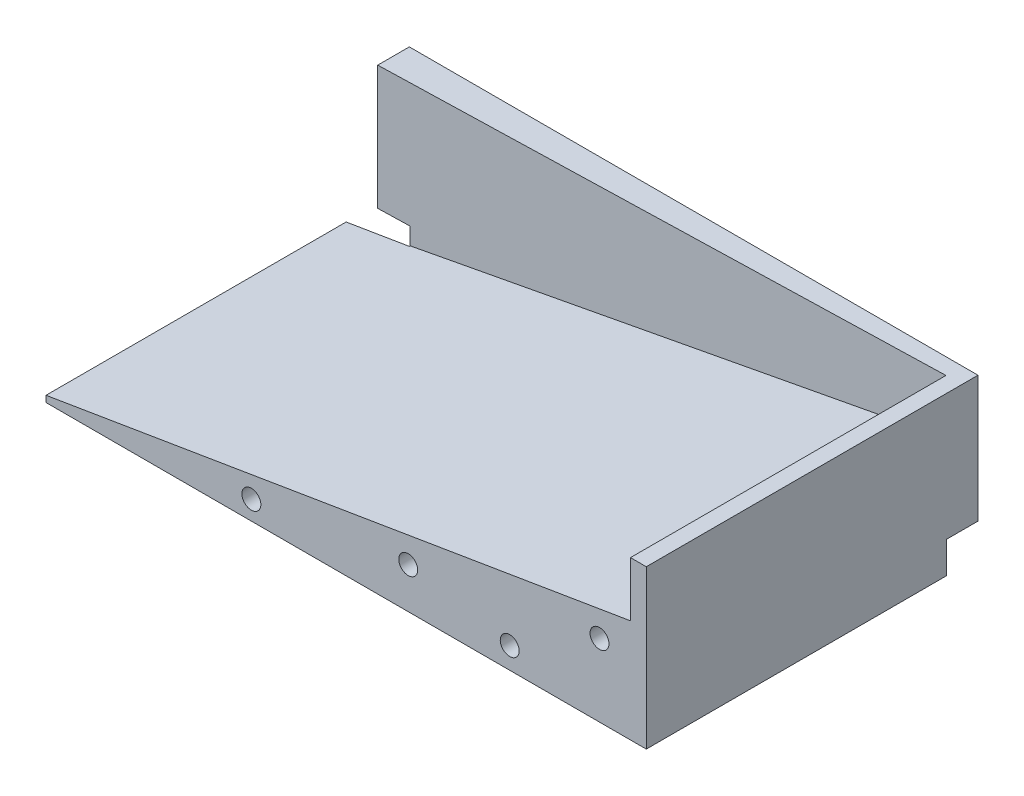
ISO-10303-21;
HEADER;
FILE_DESCRIPTION(('STEP AP214'),'2;1');
FILE_NAME('part.step','',(''),(''),'','','');
FILE_SCHEMA(('AUTOMOTIVE_DESIGN { 1 0 10303 214 1 1 1 1 }'));
ENDSEC;
DATA;
#1=APPLICATION_CONTEXT('core data for automotive mechanical design processes');
#2=APPLICATION_PROTOCOL_DEFINITION('international standard','automotive_design',2000,#1);
#3=PRODUCT_CONTEXT('',#1,'mechanical');
#4=PRODUCT('Part','Part','',(#3));
#5=PRODUCT_RELATED_PRODUCT_CATEGORY('part','',(#4));
#6=PRODUCT_DEFINITION_FORMATION('','',#4);
#7=PRODUCT_DEFINITION_CONTEXT('part definition',#1,'design');
#8=PRODUCT_DEFINITION('design','',#6,#7);
#9=PRODUCT_DEFINITION_SHAPE('','',#8);
#10=(LENGTH_UNIT() NAMED_UNIT(*) SI_UNIT(.MILLI.,.METRE.));
#11=(NAMED_UNIT(*) PLANE_ANGLE_UNIT() SI_UNIT($,.RADIAN.));
#12=(NAMED_UNIT(*) SI_UNIT($,.STERADIAN.) SOLID_ANGLE_UNIT());
#13=UNCERTAINTY_MEASURE_WITH_UNIT(LENGTH_MEASURE(1.E-05),#10,'distance_accuracy_value','');
#14=(GEOMETRIC_REPRESENTATION_CONTEXT(3) GLOBAL_UNCERTAINTY_ASSIGNED_CONTEXT((#13)) GLOBAL_UNIT_ASSIGNED_CONTEXT((#10,
#11,#12)) REPRESENTATION_CONTEXT('',''));
#15=CARTESIAN_POINT('',(0.,0.,0.));
#16=DIRECTION('',(0.,0.,1.));
#17=DIRECTION('',(1.,0.,0.));
#18=AXIS2_PLACEMENT_3D('',#15,#16,#17);
#19=CARTESIAN_POINT('',(-40.7960134047091,6.,200.));
#20=DIRECTION('',(0.,0.,-1.));
#21=DIRECTION('',(-1.,0.,0.));
#22=AXIS2_PLACEMENT_3D('',#19,#20,#21);
#23=CYLINDRICAL_SURFACE('',#22,3.);
#24=CARTESIAN_POINT('',(-40.7960134047091,6.,10.));
#25=DIRECTION('',(0.,0.,-1.));
#26=DIRECTION('',(-1.,0.,0.));
#27=AXIS2_PLACEMENT_3D('',#24,#25,#26);
#28=CIRCLE('',#27,3.);
#29=CARTESIAN_POINT('',(-43.7960134047091,6.,10.));
#30=VERTEX_POINT('',#29);
#31=EDGE_CURVE('E168',#30,#30,#28,.T.);
#32=ORIENTED_EDGE('',*,*,#31,.T.);
#33=EDGE_LOOP('',(#32));
#34=FACE_BOUND('',#33,.T.);
#35=CARTESIAN_POINT('',(-40.7960134047091,6.,100.));
#36=DIRECTION('',(0.,0.,1.));
#37=DIRECTION('',(1.,0.,0.));
#38=AXIS2_PLACEMENT_3D('',#35,#36,#37);
#39=CIRCLE('',#38,3.);
#40=CARTESIAN_POINT('',(-37.7960134047091,6.,100.));
#41=VERTEX_POINT('',#40);
#42=EDGE_CURVE('E157',#41,#41,#39,.T.);
#43=ORIENTED_EDGE('',*,*,#42,.T.);
#44=EDGE_LOOP('',(#43));
#45=FACE_BOUND('',#44,.T.);
#46=ADVANCED_FACE('F37',(#34,#45),#23,.F.);
#47=CARTESIAN_POINT('',(8.86154286614935,12.9010851063287,200.));
#48=DIRECTION('',(0.,0.,-1.));
#49=DIRECTION('',(-1.,0.,0.));
#50=AXIS2_PLACEMENT_3D('',#47,#48,#49);
#51=CYLINDRICAL_SURFACE('',#50,3.);
#52=CARTESIAN_POINT('',(8.86154286614935,12.9010851063287,10.));
#53=DIRECTION('',(0.,0.,-1.));
#54=DIRECTION('',(-1.,0.,0.));
#55=AXIS2_PLACEMENT_3D('',#52,#53,#54);
#56=CIRCLE('',#55,3.);
#57=CARTESIAN_POINT('',(5.86154286614935,12.9010851063287,10.));
#58=VERTEX_POINT('',#57);
#59=EDGE_CURVE('E174',#58,#58,#56,.T.);
#60=ORIENTED_EDGE('',*,*,#59,.T.);
#61=EDGE_LOOP('',(#60));
#62=FACE_BOUND('',#61,.T.);
#63=CARTESIAN_POINT('',(8.86154286614935,12.9010851063287,100.));
#64=DIRECTION('',(0.,0.,1.));
#65=DIRECTION('',(1.,0.,0.));
#66=AXIS2_PLACEMENT_3D('',#63,#64,#65);
#67=CIRCLE('',#66,3.);
#68=CARTESIAN_POINT('',(11.8615428661494,12.9010851063287,100.));
#69=VERTEX_POINT('',#68);
#70=EDGE_CURVE('E162',#69,#69,#67,.T.);
#71=ORIENTED_EDGE('',*,*,#70,.T.);
#72=EDGE_LOOP('',(#71));
#73=FACE_BOUND('',#72,.T.);
#74=ADVANCED_FACE('F270',(#62,#73),#51,.F.);
#75=CARTESIAN_POINT('',(40.9814690667464,6.77616521020496,200.));
#76=DIRECTION('',(0.,0.,-1.));
#77=DIRECTION('',(-1.,0.,0.));
#78=AXIS2_PLACEMENT_3D('',#75,#76,#77);
#79=CYLINDRICAL_SURFACE('',#78,3.00000000000001);
#80=CARTESIAN_POINT('',(40.9814690667464,6.77616521020496,10.));
#81=DIRECTION('',(0.,0.,-1.));
#82=DIRECTION('',(-1.,0.,0.));
#83=AXIS2_PLACEMENT_3D('',#80,#81,#82);
#84=CIRCLE('',#83,3.00000000000001);
#85=CARTESIAN_POINT('',(37.9814690667464,6.77616521020496,10.));
#86=VERTEX_POINT('',#85);
#87=EDGE_CURVE('E181',#86,#86,#84,.T.);
#88=ORIENTED_EDGE('',*,*,#87,.T.);
#89=EDGE_LOOP('',(#88));
#90=FACE_BOUND('',#89,.T.);
#91=CARTESIAN_POINT('',(40.9814690667464,6.77616521020496,100.));
#92=DIRECTION('',(0.,0.,1.));
#93=DIRECTION('',(1.,0.,0.));
#94=AXIS2_PLACEMENT_3D('',#91,#92,#93);
#95=CIRCLE('',#94,3.00000000000001);
#96=CARTESIAN_POINT('',(43.9814690667464,6.77616521020496,100.));
#97=VERTEX_POINT('',#96);
#98=EDGE_CURVE('E533',#97,#97,#95,.T.);
#99=ORIENTED_EDGE('',*,*,#98,.T.);
#100=EDGE_LOOP('',(#99));
#101=FACE_BOUND('',#100,.T.);
#102=ADVANCED_FACE('F321',(#90,#101),#79,.F.);
#103=CARTESIAN_POINT('',(69.4060048708337,22.9393971638675,200.));
#104=DIRECTION('',(0.,0.,-1.));
#105=DIRECTION('',(-1.,0.,0.));
#106=AXIS2_PLACEMENT_3D('',#103,#104,#105);
#107=CYLINDRICAL_SURFACE('',#106,3.00000000000001);
#108=CARTESIAN_POINT('',(69.4060048708337,22.9393971638675,10.));
#109=DIRECTION('',(0.,0.,-1.));
#110=DIRECTION('',(-1.,0.,0.));
#111=AXIS2_PLACEMENT_3D('',#108,#109,#110);
#112=CIRCLE('',#111,3.00000000000001);
#113=CARTESIAN_POINT('',(66.4060048708336,22.9393971638675,10.));
#114=VERTEX_POINT('',#113);
#115=EDGE_CURVE('E188',#114,#114,#112,.T.);
#116=ORIENTED_EDGE('',*,*,#115,.T.);
#117=EDGE_LOOP('',(#116));
#118=FACE_BOUND('',#117,.T.);
#119=CARTESIAN_POINT('',(69.4060048708337,22.9393971638675,100.));
#120=DIRECTION('',(0.,0.,1.));
#121=DIRECTION('',(1.,0.,0.));
#122=AXIS2_PLACEMENT_3D('',#119,#120,#121);
#123=CIRCLE('',#122,3.00000000000001);
#124=CARTESIAN_POINT('',(72.4060048708337,22.9393971638675,100.));
#125=VERTEX_POINT('',#124);
#126=EDGE_CURVE('E150',#125,#125,#123,.T.);
#127=ORIENTED_EDGE('',*,*,#126,.T.);
#128=EDGE_LOOP('',(#127));
#129=FACE_BOUND('',#128,.T.);
#130=ADVANCED_FACE('F329',(#118,#129),#107,.F.);
#131=CARTESIAN_POINT('',(-105.796013404709,2.,200.));
#132=DIRECTION('',(0.163567680624933,-0.986532114963816,0.));
#133=DIRECTION('',(0.986532114963816,0.163567680624933,0.));
#134=AXIS2_PLACEMENT_3D('',#131,#132,#133);
#135=PLANE('',#134);
#136=DIRECTION('',(-0.986532114963816,-0.163567680624933,0.));
#137=VECTOR('',#136,1.);
#138=CARTESIAN_POINT('',(-105.796013404709,2.,100.));
#139=LINE('',#138,#137);
#140=CARTESIAN_POINT('',(79.2039865952909,32.6731230100121,100.));
#141=VERTEX_POINT('',#140);
#142=CARTESIAN_POINT('',(-105.796013404709,2.,100.));
#143=VERTEX_POINT('',#142);
#144=EDGE_CURVE('E138',#141,#143,#139,.T.);
#145=ORIENTED_EDGE('',*,*,#144,.F.);
#146=DIRECTION('',(0.,0.,-1.));
#147=VECTOR('',#146,1.);
#148=CARTESIAN_POINT('',(79.2039865952909,32.6731230100121,217.967909160371));
#149=LINE('',#148,#147);
#150=CARTESIAN_POINT('',(79.2039865952909,32.6731230100121,0.138888888888883));
#151=VERTEX_POINT('',#150);
#152=EDGE_CURVE('E146',#141,#151,#149,.T.);
#153=ORIENTED_EDGE('',*,*,#152,.T.);
#154=DIRECTION('',(-0.986161899831777,-0.163506298709877,0.0273933861064383));
#155=VECTOR('',#154,1.);
#156=CARTESIAN_POINT('',(-111.056300597368,1.12784088579239,5.42389686646275));
#157=LINE('',#156,#155);
#158=CARTESIAN_POINT('',(-85.7960134047091,5.31601329837969,4.72222222222223));
#159=VERTEX_POINT('',#158);
#160=EDGE_CURVE('E243',#151,#159,#157,.T.);
#161=ORIENTED_EDGE('',*,*,#160,.T.);
#162=DIRECTION('',(0.,0.,1.));
#163=VECTOR('',#162,1.);
#164=CARTESIAN_POINT('',(-85.7960134047091,5.31601329837969,200.));
#165=LINE('',#164,#163);
#166=CARTESIAN_POINT('',(-85.7960134047091,5.31601329837969,5.));
#167=VERTEX_POINT('',#166);
#168=EDGE_CURVE('E235',#159,#167,#165,.T.);
#169=ORIENTED_EDGE('',*,*,#168,.T.);
#170=DIRECTION('',(0.986532114963816,0.163567680624933,0.));
#171=VECTOR('',#170,1.);
#172=CARTESIAN_POINT('',(-105.796013404709,2.,5.));
#173=LINE('',#172,#171);
#174=CARTESIAN_POINT('',(-105.796013404709,2.,5.));
#175=VERTEX_POINT('',#174);
#176=EDGE_CURVE('E230',#175,#167,#173,.T.);
#177=ORIENTED_EDGE('',*,*,#176,.F.);
#178=DIRECTION('',(0.,0.,-1.));
#179=VECTOR('',#178,1.);
#180=CARTESIAN_POINT('',(-105.796013404709,2.,200.));
#181=LINE('',#180,#179);
#182=EDGE_CURVE('E149',#143,#175,#181,.T.);
#183=ORIENTED_EDGE('',*,*,#182,.F.);
#184=EDGE_LOOP('',(#145,#153,#161,#169,#177,#183));
#185=FACE_BOUND('',#184,.T.);
#186=ADVANCED_FACE('F145',(#185),#135,.F.);
#187=CARTESIAN_POINT('',(-105.796013404709,0.,200.));
#188=DIRECTION('',(1.,0.,0.));
#189=DIRECTION('',(0.,0.,-1.));
#190=AXIS2_PLACEMENT_3D('',#187,#188,#189);
#191=PLANE('',#190);
#192=DIRECTION('',(0.,-1.,0.));
#193=VECTOR('',#192,1.);
#194=CARTESIAN_POINT('',(-105.796013404709,0.,100.));
#195=LINE('',#194,#193);
#196=CARTESIAN_POINT('',(-105.796013404709,0.,100.));
#197=VERTEX_POINT('',#196);
#198=EDGE_CURVE('E151',#143,#197,#195,.T.);
#199=ORIENTED_EDGE('',*,*,#198,.F.);
#200=ORIENTED_EDGE('',*,*,#182,.T.);
#201=DIRECTION('',(0.,1.,0.));
#202=VECTOR('',#201,1.);
#203=CARTESIAN_POINT('',(-105.796013404709,0.,5.));
#204=LINE('',#203,#202);
#205=CARTESIAN_POINT('',(-105.796013404709,0.,5.));
#206=VERTEX_POINT('',#205);
#207=EDGE_CURVE('E214',#206,#175,#204,.T.);
#208=ORIENTED_EDGE('',*,*,#207,.F.);
#209=DIRECTION('',(0.,0.,-1.));
#210=VECTOR('',#209,1.);
#211=CARTESIAN_POINT('',(-105.796013404709,0.,200.));
#212=LINE('',#211,#210);
#213=EDGE_CURVE('E260',#197,#206,#212,.T.);
#214=ORIENTED_EDGE('',*,*,#213,.F.);
#215=EDGE_LOOP('',(#199,#200,#208,#214));
#216=FACE_BOUND('',#215,.T.);
#217=ADVANCED_FACE('F39',(#216),#191,.F.);
#218=CARTESIAN_POINT('',(-105.796013404709,0.,200.));
#219=DIRECTION('',(0.,1.,0.));
#220=DIRECTION('',(0.,0.,1.));
#221=AXIS2_PLACEMENT_3D('',#218,#219,#220);
#222=PLANE('',#221);
#223=DIRECTION('',(1.,0.,0.));
#224=VECTOR('',#223,1.);
#225=CARTESIAN_POINT('',(-105.796013404709,0.,100.));
#226=LINE('',#225,#224);
#227=CARTESIAN_POINT('',(84.2039865952909,0.,100.));
#228=VERTEX_POINT('',#227);
#229=EDGE_CURVE('E349',#197,#228,#226,.T.);
#230=ORIENTED_EDGE('',*,*,#229,.F.);
#231=ORIENTED_EDGE('',*,*,#213,.T.);
#232=DIRECTION('',(-1.,0.,0.));
#233=VECTOR('',#232,1.);
#234=CARTESIAN_POINT('',(-105.796013404709,0.,5.));
#235=LINE('',#234,#233);
#236=CARTESIAN_POINT('',(-85.7960134047091,0.,5.));
#237=VERTEX_POINT('',#236);
#238=EDGE_CURVE('E220',#237,#206,#235,.T.);
#239=ORIENTED_EDGE('',*,*,#238,.F.);
#240=DIRECTION('',(0.,0.,-1.));
#241=VECTOR('',#240,1.);
#242=CARTESIAN_POINT('',(-85.7960134047091,0.,5.));
#243=LINE('',#242,#241);
#244=CARTESIAN_POINT('',(-85.7960134047091,0.,-5.));
#245=VERTEX_POINT('',#244);
#246=EDGE_CURVE('E227',#237,#245,#243,.T.);
#247=ORIENTED_EDGE('',*,*,#246,.T.);
#248=DIRECTION('',(1.,0.,0.));
#249=VECTOR('',#248,1.);
#250=CARTESIAN_POINT('',(-95.7960134047091,0.,-5.));
#251=LINE('',#250,#249);
#252=CARTESIAN_POINT('',(74.2039865952908,0.,-5.));
#253=VERTEX_POINT('',#252);
#254=EDGE_CURVE('E364',#245,#253,#251,.T.);
#255=ORIENTED_EDGE('',*,*,#254,.T.);
#256=DIRECTION('',(0.,0.,-1.));
#257=VECTOR('',#256,1.);
#258=CARTESIAN_POINT('',(74.2039865952909,0.,-5.));
#259=LINE('',#258,#257);
#260=CARTESIAN_POINT('',(74.2039865952909,0.,5.));
#261=VERTEX_POINT('',#260);
#262=EDGE_CURVE('E59',#261,#253,#259,.T.);
#263=ORIENTED_EDGE('',*,*,#262,.F.);
#264=DIRECTION('',(1.,0.,0.));
#265=VECTOR('',#264,1.);
#266=CARTESIAN_POINT('',(74.2039865952909,0.,5.));
#267=LINE('',#266,#265);
#268=CARTESIAN_POINT('',(84.2039865952909,0.,5.));
#269=VERTEX_POINT('',#268);
#270=EDGE_CURVE('E207',#261,#269,#267,.T.);
#271=ORIENTED_EDGE('',*,*,#270,.T.);
#272=DIRECTION('',(0.,0.,-1.));
#273=VECTOR('',#272,1.);
#274=CARTESIAN_POINT('',(84.2039865952909,0.,200.));
#275=LINE('',#274,#273);
#276=EDGE_CURVE('E352',#228,#269,#275,.T.);
#277=ORIENTED_EDGE('',*,*,#276,.F.);
#278=EDGE_LOOP('',(#230,#231,#239,#247,#255,#263,#271,#277));
#279=FACE_BOUND('',#278,.T.);
#280=ADVANCED_FACE('F339',(#279),#222,.F.);
#281=CARTESIAN_POINT('',(84.2039865952909,0.,200.));
#282=DIRECTION('',(-1.,0.,0.));
#283=DIRECTION('',(0.,0.,1.));
#284=AXIS2_PLACEMENT_3D('',#281,#282,#283);
#285=PLANE('',#284);
#286=DIRECTION('',(0.,1.,0.));
#287=VECTOR('',#286,1.);
#288=CARTESIAN_POINT('',(84.2039865952909,0.,100.));
#289=LINE('',#288,#287);
#290=CARTESIAN_POINT('',(84.2039865952909,50.,100.));
#291=VERTEX_POINT('',#290);
#292=EDGE_CURVE('E354',#228,#291,#289,.T.);
#293=ORIENTED_EDGE('',*,*,#292,.F.);
#294=ORIENTED_EDGE('',*,*,#276,.T.);
#295=DIRECTION('',(0.,-1.,0.));
#296=VECTOR('',#295,1.);
#297=CARTESIAN_POINT('',(84.2039865952909,0.,5.));
#298=LINE('',#297,#296);
#299=CARTESIAN_POINT('',(84.2039865952909,10.,5.));
#300=VERTEX_POINT('',#299);
#301=EDGE_CURVE('E195',#300,#269,#298,.T.);
#302=ORIENTED_EDGE('',*,*,#301,.F.);
#303=DIRECTION('',(0.,0.,1.));
#304=VECTOR('',#303,1.);
#305=CARTESIAN_POINT('',(84.2039865952909,10.,-5.));
#306=LINE('',#305,#304);
#307=CARTESIAN_POINT('',(84.2039865952909,10.,-5.));
#308=VERTEX_POINT('',#307);
#309=EDGE_CURVE('E202',#308,#300,#306,.T.);
#310=ORIENTED_EDGE('',*,*,#309,.F.);
#311=DIRECTION('',(0.,1.,0.));
#312=VECTOR('',#311,1.);
#313=CARTESIAN_POINT('',(84.2039865952909,0.,-5.));
#314=LINE('',#313,#312);
#315=CARTESIAN_POINT('',(84.2039865952909,50.,-5.));
#316=VERTEX_POINT('',#315);
#317=EDGE_CURVE('E250',#308,#316,#314,.T.);
#318=ORIENTED_EDGE('',*,*,#317,.T.);
#319=DIRECTION('',(0.,0.,1.));
#320=VECTOR('',#319,1.);
#321=CARTESIAN_POINT('',(84.2039865952909,50.,200.));
#322=LINE('',#321,#320);
#323=EDGE_CURVE('E360',#316,#291,#322,.T.);
#324=ORIENTED_EDGE('',*,*,#323,.T.);
#325=EDGE_LOOP('',(#293,#294,#302,#310,#318,#324));
#326=FACE_BOUND('',#325,.T.);
#327=ADVANCED_FACE('F336',(#326),#285,.F.);
#328=CARTESIAN_POINT('',(-95.7960134047091,50.,200.));
#329=DIRECTION('',(0.,1.,0.));
#330=DIRECTION('',(0.,0.,1.));
#331=AXIS2_PLACEMENT_3D('',#328,#329,#330);
#332=PLANE('',#331);
#333=DIRECTION('',(0.,0.,-1.));
#334=VECTOR('',#333,1.);
#335=CARTESIAN_POINT('',(79.2039865952909,50.,217.967909160371));
#336=LINE('',#335,#334);
#337=CARTESIAN_POINT('',(79.2039865952909,50.,100.));
#338=VERTEX_POINT('',#337);
#339=CARTESIAN_POINT('',(79.2039865952909,50.,0.138888888888885));
#340=VERTEX_POINT('',#339);
#341=EDGE_CURVE('E156',#338,#340,#336,.T.);
#342=ORIENTED_EDGE('',*,*,#341,.F.);
#343=DIRECTION('',(1.,0.,0.));
#344=VECTOR('',#343,1.);
#345=CARTESIAN_POINT('',(-95.7960134047091,50.,100.));
#346=LINE('',#345,#344);
#347=EDGE_CURVE('E52',#338,#291,#346,.T.);
#348=ORIENTED_EDGE('',*,*,#347,.T.);
#349=ORIENTED_EDGE('',*,*,#323,.F.);
#350=DIRECTION('',(1.,0.,0.));
#351=VECTOR('',#350,1.);
#352=CARTESIAN_POINT('',(-95.7960134047091,50.,-5.));
#353=LINE('',#352,#351);
#354=CARTESIAN_POINT('',(-95.7960134047091,50.,-5.));
#355=VERTEX_POINT('',#354);
#356=EDGE_CURVE('E363',#355,#316,#353,.T.);
#357=ORIENTED_EDGE('',*,*,#356,.F.);
#358=DIRECTION('',(0.,0.,1.));
#359=VECTOR('',#358,1.);
#360=CARTESIAN_POINT('',(-95.7960134047091,50.,0.));
#361=LINE('',#360,#359);
#362=CARTESIAN_POINT('',(-95.7960134047091,50.,5.));
#363=VERTEX_POINT('',#362);
#364=EDGE_CURVE('E367',#355,#363,#361,.T.);
#365=ORIENTED_EDGE('',*,*,#364,.T.);
#366=DIRECTION('',(0.999614420652718,0.,-0.0277670672403533));
#367=VECTOR('',#366,1.);
#368=CARTESIAN_POINT('',(-95.7960134047091,50.,5.));
#369=LINE('',#368,#367);
#370=EDGE_CURVE('E238',#363,#340,#369,.T.);
#371=ORIENTED_EDGE('',*,*,#370,.T.);
#372=EDGE_LOOP('',(#342,#348,#349,#357,#365,#371));
#373=FACE_BOUND('',#372,.T.);
#374=ADVANCED_FACE('F338',(#373),#332,.T.);
#375=CARTESIAN_POINT('',(79.2039865952909,32.6731230100121,217.967909160371));
#376=DIRECTION('',(-1.,0.,0.));
#377=DIRECTION('',(0.,0.,1.));
#378=AXIS2_PLACEMENT_3D('',#375,#376,#377);
#379=PLANE('',#378);
#380=ORIENTED_EDGE('',*,*,#152,.F.);
#381=DIRECTION('',(0.,1.,0.));
#382=VECTOR('',#381,1.);
#383=CARTESIAN_POINT('',(79.2039865952909,32.6731230100121,100.));
#384=LINE('',#383,#382);
#385=EDGE_CURVE('E11',#141,#338,#384,.T.);
#386=ORIENTED_EDGE('',*,*,#385,.T.);
#387=ORIENTED_EDGE('',*,*,#341,.T.);
#388=DIRECTION('',(0.,-1.,0.));
#389=VECTOR('',#388,1.);
#390=CARTESIAN_POINT('',(79.2039865952909,-180.069431053691,0.138888888888888));
#391=LINE('',#390,#389);
#392=EDGE_CURVE('E45',#340,#151,#391,.T.);
#393=ORIENTED_EDGE('',*,*,#392,.T.);
#394=EDGE_LOOP('',(#380,#386,#387,#393));
#395=FACE_BOUND('',#394,.T.);
#396=ADVANCED_FACE('F153',(#395),#379,.T.);
#397=CARTESIAN_POINT('',(-95.7960134047091,0.,0.));
#398=DIRECTION('',(-1.,0.,0.));
#399=DIRECTION('',(0.,0.,1.));
#400=AXIS2_PLACEMENT_3D('',#397,#398,#399);
#401=PLANE('',#400);
#402=DIRECTION('',(0.,0.,-1.));
#403=VECTOR('',#402,1.);
#404=CARTESIAN_POINT('',(-95.7960134047091,10.7198341627884,0.));
#405=LINE('',#404,#403);
#406=CARTESIAN_POINT('',(-95.7960134047091,10.7198341627884,5.));
#407=VERTEX_POINT('',#406);
#408=CARTESIAN_POINT('',(-95.7960134047091,10.7198341627884,-5.));
#409=VERTEX_POINT('',#408);
#410=EDGE_CURVE('E233',#407,#409,#405,.T.);
#411=ORIENTED_EDGE('',*,*,#410,.F.);
#412=DIRECTION('',(0.,1.,0.));
#413=VECTOR('',#412,1.);
#414=CARTESIAN_POINT('',(-95.7960134047091,-180.069431053691,5.));
#415=LINE('',#414,#413);
#416=EDGE_CURVE('E241',#407,#363,#415,.T.);
#417=ORIENTED_EDGE('',*,*,#416,.T.);
#418=ORIENTED_EDGE('',*,*,#364,.F.);
#419=DIRECTION('',(0.,1.,0.));
#420=VECTOR('',#419,1.);
#421=CARTESIAN_POINT('',(-95.7960134047091,0.,-5.));
#422=LINE('',#421,#420);
#423=EDGE_CURVE('E246',#409,#355,#422,.T.);
#424=ORIENTED_EDGE('',*,*,#423,.F.);
#425=EDGE_LOOP('',(#411,#417,#418,#424));
#426=FACE_BOUND('',#425,.T.);
#427=ADVANCED_FACE('F291',(#426),#401,.T.);
#428=CARTESIAN_POINT('',(-95.7960134047091,0.,-5.));
#429=DIRECTION('',(0.,0.,-1.));
#430=DIRECTION('',(-1.,0.,0.));
#431=AXIS2_PLACEMENT_3D('',#428,#429,#430);
#432=PLANE('',#431);
#433=ORIENTED_EDGE('',*,*,#356,.T.);
#434=ORIENTED_EDGE('',*,*,#317,.F.);
#435=DIRECTION('',(1.,0.,0.));
#436=VECTOR('',#435,1.);
#437=CARTESIAN_POINT('',(74.2039865952909,10.,-5.));
#438=LINE('',#437,#436);
#439=CARTESIAN_POINT('',(74.2039865952909,10.,-5.));
#440=VERTEX_POINT('',#439);
#441=EDGE_CURVE('E201',#440,#308,#438,.T.);
#442=ORIENTED_EDGE('',*,*,#441,.F.);
#443=DIRECTION('',(0.,1.,0.));
#444=VECTOR('',#443,1.);
#445=CARTESIAN_POINT('',(74.2039865952909,0.,-5.));
#446=LINE('',#445,#444);
#447=EDGE_CURVE('E192',#253,#440,#446,.T.);
#448=ORIENTED_EDGE('',*,*,#447,.F.);
#449=ORIENTED_EDGE('',*,*,#254,.F.);
#450=DIRECTION('',(0.,-1.,0.));
#451=VECTOR('',#450,1.);
#452=CARTESIAN_POINT('',(-85.7960134047091,0.,-5.));
#453=LINE('',#452,#451);
#454=CARTESIAN_POINT('',(-85.7960134047091,10.7198341627884,-5.));
#455=VERTEX_POINT('',#454);
#456=EDGE_CURVE('E218',#455,#245,#453,.T.);
#457=ORIENTED_EDGE('',*,*,#456,.F.);
#458=DIRECTION('',(1.,0.,0.));
#459=VECTOR('',#458,1.);
#460=CARTESIAN_POINT('',(-105.796013404709,10.7198341627884,-5.));
#461=LINE('',#460,#459);
#462=EDGE_CURVE('E210',#409,#455,#461,.T.);
#463=ORIENTED_EDGE('',*,*,#462,.F.);
#464=ORIENTED_EDGE('',*,*,#423,.T.);
#465=EDGE_LOOP('',(#433,#434,#442,#448,#449,#457,#463,#464));
#466=FACE_BOUND('',#465,.T.);
#467=CARTESIAN_POINT('',(-40.7960134047091,6.,-5.));
#468=DIRECTION('',(0.,0.,-1.));
#469=DIRECTION('',(-1.,0.,0.));
#470=AXIS2_PLACEMENT_3D('',#467,#468,#469);
#471=CIRCLE('',#470,5.);
#472=CARTESIAN_POINT('',(-45.7960134047091,6.,-5.));
#473=VERTEX_POINT('',#472);
#474=EDGE_CURVE('E159',#473,#473,#471,.T.);
#475=ORIENTED_EDGE('',*,*,#474,.F.);
#476=EDGE_LOOP('',(#475));
#477=FACE_BOUND('',#476,.T.);
#478=CARTESIAN_POINT('',(8.86154286614935,12.9010851063287,-5.));
#479=DIRECTION('',(0.,0.,-1.));
#480=DIRECTION('',(-1.,0.,0.));
#481=AXIS2_PLACEMENT_3D('',#478,#479,#480);
#482=CIRCLE('',#481,5.);
#483=CARTESIAN_POINT('',(3.86154286614935,12.9010851063287,-5.));
#484=VERTEX_POINT('',#483);
#485=EDGE_CURVE('E175',#484,#484,#482,.T.);
#486=ORIENTED_EDGE('',*,*,#485,.F.);
#487=EDGE_LOOP('',(#486));
#488=FACE_BOUND('',#487,.T.);
#489=CARTESIAN_POINT('',(40.9814690667464,6.77616521020496,-5.));
#490=DIRECTION('',(0.,0.,-1.));
#491=DIRECTION('',(-1.,0.,0.));
#492=AXIS2_PLACEMENT_3D('',#489,#490,#491);
#493=CIRCLE('',#492,5.);
#494=CARTESIAN_POINT('',(35.9814690667464,6.77616521020496,-5.));
#495=VERTEX_POINT('',#494);
#496=EDGE_CURVE('E182',#495,#495,#493,.T.);
#497=ORIENTED_EDGE('',*,*,#496,.F.);
#498=EDGE_LOOP('',(#497));
#499=FACE_BOUND('',#498,.T.);
#500=CARTESIAN_POINT('',(69.4060048708337,22.9393971638675,-5.));
#501=DIRECTION('',(0.,0.,-1.));
#502=DIRECTION('',(-1.,0.,0.));
#503=AXIS2_PLACEMENT_3D('',#500,#501,#502);
#504=CIRCLE('',#503,5.);
#505=CARTESIAN_POINT('',(64.4060048708336,22.9393971638675,-5.));
#506=VERTEX_POINT('',#505);
#507=EDGE_CURVE('E189',#506,#506,#504,.T.);
#508=ORIENTED_EDGE('',*,*,#507,.F.);
#509=EDGE_LOOP('',(#508));
#510=FACE_BOUND('',#509,.T.);
#511=ADVANCED_FACE('F287',(#466,#477,#488,#499,#510),#432,.T.);
#512=CARTESIAN_POINT('',(-95.7960134047091,-180.069431053691,5.));
#513=DIRECTION('',(0.0277670672403533,0.,0.999614420652718));
#514=DIRECTION('',(0.999614420652718,0.,-0.0277670672403533));
#515=AXIS2_PLACEMENT_3D('',#512,#513,#514);
#516=PLANE('',#515);
#517=ORIENTED_EDGE('',*,*,#392,.F.);
#518=ORIENTED_EDGE('',*,*,#370,.F.);
#519=ORIENTED_EDGE('',*,*,#416,.F.);
#520=DIRECTION('',(-0.999614420652718,0.,0.0277670672403533));
#521=VECTOR('',#520,1.);
#522=CARTESIAN_POINT('',(-95.7960134047091,10.7198341627884,5.));
#523=LINE('',#522,#521);
#524=CARTESIAN_POINT('',(-85.7960134047091,10.7198341627884,4.72222222222222));
#525=VERTEX_POINT('',#524);
#526=EDGE_CURVE('E254',#525,#407,#523,.T.);
#527=ORIENTED_EDGE('',*,*,#526,.F.);
#528=DIRECTION('',(0.,1.,0.));
#529=VECTOR('',#528,1.);
#530=CARTESIAN_POINT('',(-85.7960134047091,-180.069431053691,4.72222222222222));
#531=LINE('',#530,#529);
#532=EDGE_CURVE('E252',#159,#525,#531,.T.);
#533=ORIENTED_EDGE('',*,*,#532,.F.);
#534=ORIENTED_EDGE('',*,*,#160,.F.);
#535=EDGE_LOOP('',(#517,#518,#519,#527,#533,#534));
#536=FACE_BOUND('',#535,.T.);
#537=ADVANCED_FACE('F290',(#536),#516,.T.);
#538=CARTESIAN_POINT('',(-85.7960134047091,0.,5.));
#539=DIRECTION('',(1.,0.,0.));
#540=DIRECTION('',(0.,0.,-1.));
#541=AXIS2_PLACEMENT_3D('',#538,#539,#540);
#542=PLANE('',#541);
#543=ORIENTED_EDGE('',*,*,#532,.T.);
#544=DIRECTION('',(0.,0.,-1.));
#545=VECTOR('',#544,1.);
#546=CARTESIAN_POINT('',(-85.7960134047091,10.7198341627884,5.));
#547=LINE('',#546,#545);
#548=EDGE_CURVE('E223',#525,#455,#547,.T.);
#549=ORIENTED_EDGE('',*,*,#548,.T.);
#550=ORIENTED_EDGE('',*,*,#456,.T.);
#551=ORIENTED_EDGE('',*,*,#246,.F.);
#552=DIRECTION('',(0.,-1.,0.));
#553=VECTOR('',#552,1.);
#554=CARTESIAN_POINT('',(-85.7960134047091,0.,5.));
#555=LINE('',#554,#553);
#556=EDGE_CURVE('E217',#167,#237,#555,.T.);
#557=ORIENTED_EDGE('',*,*,#556,.F.);
#558=ORIENTED_EDGE('',*,*,#168,.F.);
#559=EDGE_LOOP('',(#543,#549,#550,#551,#557,#558));
#560=FACE_BOUND('',#559,.T.);
#561=ADVANCED_FACE('F394',(#560),#542,.F.);
#562=CARTESIAN_POINT('',(0.,0.,5.));
#563=DIRECTION('',(0.,0.,-1.));
#564=DIRECTION('',(-1.,0.,0.));
#565=AXIS2_PLACEMENT_3D('',#562,#563,#564);
#566=PLANE('',#565);
#567=ORIENTED_EDGE('',*,*,#176,.T.);
#568=ORIENTED_EDGE('',*,*,#556,.T.);
#569=ORIENTED_EDGE('',*,*,#238,.T.);
#570=ORIENTED_EDGE('',*,*,#207,.T.);
#571=EDGE_LOOP('',(#567,#568,#569,#570));
#572=FACE_BOUND('',#571,.T.);
#573=ADVANCED_FACE('F400',(#572),#566,.T.);
#574=CARTESIAN_POINT('',(-105.796013404709,10.7198341627884,5.));
#575=DIRECTION('',(0.,1.,0.));
#576=DIRECTION('',(0.,0.,1.));
#577=AXIS2_PLACEMENT_3D('',#574,#575,#576);
#578=PLANE('',#577);
#579=ORIENTED_EDGE('',*,*,#410,.T.);
#580=ORIENTED_EDGE('',*,*,#462,.T.);
#581=ORIENTED_EDGE('',*,*,#548,.F.);
#582=ORIENTED_EDGE('',*,*,#526,.T.);
#583=EDGE_LOOP('',(#579,#580,#581,#582));
#584=FACE_BOUND('',#583,.T.);
#585=ADVANCED_FACE('F397',(#584),#578,.F.);
#586=CARTESIAN_POINT('',(74.2039865952909,0.,5.));
#587=DIRECTION('',(0.,0.,1.));
#588=DIRECTION('',(1.,0.,0.));
#589=AXIS2_PLACEMENT_3D('',#586,#587,#588);
#590=PLANE('',#589);
#591=ORIENTED_EDGE('',*,*,#301,.T.);
#592=ORIENTED_EDGE('',*,*,#270,.F.);
#593=DIRECTION('',(0.,-1.,0.));
#594=VECTOR('',#593,1.);
#595=CARTESIAN_POINT('',(74.2039865952909,0.,5.));
#596=LINE('',#595,#594);
#597=CARTESIAN_POINT('',(74.2039865952909,10.,5.));
#598=VERTEX_POINT('',#597);
#599=EDGE_CURVE('E198',#598,#261,#596,.T.);
#600=ORIENTED_EDGE('',*,*,#599,.F.);
#601=DIRECTION('',(1.,0.,0.));
#602=VECTOR('',#601,1.);
#603=CARTESIAN_POINT('',(74.2039865952909,10.,5.));
#604=LINE('',#603,#602);
#605=EDGE_CURVE('E211',#598,#300,#604,.T.);
#606=ORIENTED_EDGE('',*,*,#605,.T.);
#607=EDGE_LOOP('',(#591,#592,#600,#606));
#608=FACE_BOUND('',#607,.T.);
#609=ADVANCED_FACE('F399',(#608),#590,.F.);
#610=CARTESIAN_POINT('',(74.2039865952909,10.,-5.));
#611=DIRECTION('',(0.,1.,0.));
#612=DIRECTION('',(0.,0.,1.));
#613=AXIS2_PLACEMENT_3D('',#610,#611,#612);
#614=PLANE('',#613);
#615=ORIENTED_EDGE('',*,*,#309,.T.);
#616=ORIENTED_EDGE('',*,*,#605,.F.);
#617=DIRECTION('',(0.,0.,1.));
#618=VECTOR('',#617,1.);
#619=CARTESIAN_POINT('',(74.2039865952909,10.,-5.));
#620=LINE('',#619,#618);
#621=EDGE_CURVE('E194',#440,#598,#620,.T.);
#622=ORIENTED_EDGE('',*,*,#621,.F.);
#623=ORIENTED_EDGE('',*,*,#441,.T.);
#624=EDGE_LOOP('',(#615,#616,#622,#623));
#625=FACE_BOUND('',#624,.T.);
#626=ADVANCED_FACE('F311',(#625),#614,.F.);
#627=CARTESIAN_POINT('',(74.2039865952909,0.,0.));
#628=DIRECTION('',(1.,0.,0.));
#629=DIRECTION('',(0.,0.,-1.));
#630=AXIS2_PLACEMENT_3D('',#627,#628,#629);
#631=PLANE('',#630);
#632=ORIENTED_EDGE('',*,*,#447,.T.);
#633=ORIENTED_EDGE('',*,*,#621,.T.);
#634=ORIENTED_EDGE('',*,*,#599,.T.);
#635=ORIENTED_EDGE('',*,*,#262,.T.);
#636=EDGE_LOOP('',(#632,#633,#634,#635));
#637=FACE_BOUND('',#636,.T.);
#638=ADVANCED_FACE('F301',(#637),#631,.T.);
#639=CARTESIAN_POINT('',(69.4060048708337,22.9393971638675,10.));
#640=DIRECTION('',(0.,0.,-1.));
#641=DIRECTION('',(-1.,0.,0.));
#642=AXIS2_PLACEMENT_3D('',#639,#640,#641);
#643=CYLINDRICAL_SURFACE('',#642,5.);
#644=CARTESIAN_POINT('',(69.4060048708337,22.9393971638675,10.));
#645=DIRECTION('',(0.,0.,-1.));
#646=DIRECTION('',(-1.,0.,0.));
#647=AXIS2_PLACEMENT_3D('',#644,#645,#646);
#648=CIRCLE('',#647,5.);
#649=CARTESIAN_POINT('',(64.4060048708336,22.9393971638675,10.));
#650=VERTEX_POINT('',#649);
#651=EDGE_CURVE('E185',#650,#650,#648,.T.);
#652=ORIENTED_EDGE('',*,*,#651,.F.);
#653=EDGE_LOOP('',(#652));
#654=FACE_BOUND('',#653,.T.);
#655=ORIENTED_EDGE('',*,*,#507,.T.);
#656=EDGE_LOOP('',(#655));
#657=FACE_BOUND('',#656,.T.);
#658=ADVANCED_FACE('F298',(#654,#657),#643,.F.);
#659=CARTESIAN_POINT('',(69.4060048708337,22.9393971638675,10.));
#660=DIRECTION('',(0.,0.,-1.));
#661=DIRECTION('',(-1.,0.,0.));
#662=AXIS2_PLACEMENT_3D('',#659,#660,#661);
#663=PLANE('',#662);
#664=ORIENTED_EDGE('',*,*,#115,.F.);
#665=EDGE_LOOP('',(#664));
#666=FACE_BOUND('',#665,.T.);
#667=ORIENTED_EDGE('',*,*,#651,.T.);
#668=EDGE_LOOP('',(#667));
#669=FACE_BOUND('',#668,.T.);
#670=ADVANCED_FACE('F300',(#666,#669),#663,.T.);
#671=CARTESIAN_POINT('',(40.9814690667464,6.77616521020496,10.));
#672=DIRECTION('',(0.,0.,-1.));
#673=DIRECTION('',(-1.,0.,0.));
#674=AXIS2_PLACEMENT_3D('',#671,#672,#673);
#675=CYLINDRICAL_SURFACE('',#674,5.);
#676=CARTESIAN_POINT('',(40.9814690667464,6.77616521020496,10.));
#677=DIRECTION('',(0.,0.,-1.));
#678=DIRECTION('',(-1.,0.,0.));
#679=AXIS2_PLACEMENT_3D('',#676,#677,#678);
#680=CIRCLE('',#679,5.);
#681=CARTESIAN_POINT('',(35.9814690667464,6.77616521020496,10.));
#682=VERTEX_POINT('',#681);
#683=EDGE_CURVE('E178',#682,#682,#680,.T.);
#684=ORIENTED_EDGE('',*,*,#683,.F.);
#685=EDGE_LOOP('',(#684));
#686=FACE_BOUND('',#685,.T.);
#687=ORIENTED_EDGE('',*,*,#496,.T.);
#688=EDGE_LOOP('',(#687));
#689=FACE_BOUND('',#688,.T.);
#690=ADVANCED_FACE('F308',(#686,#689),#675,.F.);
#691=CARTESIAN_POINT('',(40.9814690667464,6.77616521020496,10.));
#692=DIRECTION('',(0.,0.,-1.));
#693=DIRECTION('',(-1.,0.,0.));
#694=AXIS2_PLACEMENT_3D('',#691,#692,#693);
#695=PLANE('',#694);
#696=ORIENTED_EDGE('',*,*,#87,.F.);
#697=EDGE_LOOP('',(#696));
#698=FACE_BOUND('',#697,.T.);
#699=ORIENTED_EDGE('',*,*,#683,.T.);
#700=EDGE_LOOP('',(#699));
#701=FACE_BOUND('',#700,.T.);
#702=ADVANCED_FACE('F283',(#698,#701),#695,.T.);
#703=CARTESIAN_POINT('',(8.86154286614935,12.9010851063287,10.));
#704=DIRECTION('',(0.,0.,-1.));
#705=DIRECTION('',(-1.,0.,0.));
#706=AXIS2_PLACEMENT_3D('',#703,#704,#705);
#707=CYLINDRICAL_SURFACE('',#706,5.);
#708=CARTESIAN_POINT('',(8.86154286614935,12.9010851063287,10.));
#709=DIRECTION('',(0.,0.,-1.));
#710=DIRECTION('',(-1.,0.,0.));
#711=AXIS2_PLACEMENT_3D('',#708,#709,#710);
#712=CIRCLE('',#711,5.);
#713=CARTESIAN_POINT('',(3.86154286614935,12.9010851063287,10.));
#714=VERTEX_POINT('',#713);
#715=EDGE_CURVE('E171',#714,#714,#712,.T.);
#716=ORIENTED_EDGE('',*,*,#715,.F.);
#717=EDGE_LOOP('',(#716));
#718=FACE_BOUND('',#717,.T.);
#719=ORIENTED_EDGE('',*,*,#485,.T.);
#720=EDGE_LOOP('',(#719));
#721=FACE_BOUND('',#720,.T.);
#722=ADVANCED_FACE('F277',(#718,#721),#707,.F.);
#723=CARTESIAN_POINT('',(8.86154286614935,12.9010851063287,10.));
#724=DIRECTION('',(0.,0.,-1.));
#725=DIRECTION('',(-1.,0.,0.));
#726=AXIS2_PLACEMENT_3D('',#723,#724,#725);
#727=PLANE('',#726);
#728=ORIENTED_EDGE('',*,*,#59,.F.);
#729=EDGE_LOOP('',(#728));
#730=FACE_BOUND('',#729,.T.);
#731=ORIENTED_EDGE('',*,*,#715,.T.);
#732=EDGE_LOOP('',(#731));
#733=FACE_BOUND('',#732,.T.);
#734=ADVANCED_FACE('F273',(#730,#733),#727,.T.);
#735=CARTESIAN_POINT('',(-40.7960134047091,6.,10.));
#736=DIRECTION('',(0.,0.,-1.));
#737=DIRECTION('',(-1.,0.,0.));
#738=AXIS2_PLACEMENT_3D('',#735,#736,#737);
#739=CYLINDRICAL_SURFACE('',#738,5.);
#740=CARTESIAN_POINT('',(-40.7960134047091,6.,10.));
#741=DIRECTION('',(0.,0.,-1.));
#742=DIRECTION('',(-1.,0.,0.));
#743=AXIS2_PLACEMENT_3D('',#740,#741,#742);
#744=CIRCLE('',#743,5.);
#745=CARTESIAN_POINT('',(-45.7960134047091,6.,10.));
#746=VERTEX_POINT('',#745);
#747=EDGE_CURVE('E165',#746,#746,#744,.T.);
#748=ORIENTED_EDGE('',*,*,#747,.F.);
#749=EDGE_LOOP('',(#748));
#750=FACE_BOUND('',#749,.T.);
#751=ORIENTED_EDGE('',*,*,#474,.T.);
#752=EDGE_LOOP('',(#751));
#753=FACE_BOUND('',#752,.T.);
#754=ADVANCED_FACE('F276',(#750,#753),#739,.F.);
#755=CARTESIAN_POINT('',(-40.7960134047091,6.,10.));
#756=DIRECTION('',(0.,0.,-1.));
#757=DIRECTION('',(-1.,0.,0.));
#758=AXIS2_PLACEMENT_3D('',#755,#756,#757);
#759=PLANE('',#758);
#760=ORIENTED_EDGE('',*,*,#31,.F.);
#761=EDGE_LOOP('',(#760));
#762=FACE_BOUND('',#761,.T.);
#763=ORIENTED_EDGE('',*,*,#747,.T.);
#764=EDGE_LOOP('',(#763));
#765=FACE_BOUND('',#764,.T.);
#766=ADVANCED_FACE('F424',(#762,#765),#759,.T.);
#767=CARTESIAN_POINT('',(0.,0.,100.));
#768=DIRECTION('',(0.,0.,1.));
#769=DIRECTION('',(1.,0.,0.));
#770=AXIS2_PLACEMENT_3D('',#767,#768,#769);
#771=PLANE('',#770);
#772=ORIENTED_EDGE('',*,*,#42,.F.);
#773=EDGE_LOOP('',(#772));
#774=FACE_BOUND('',#773,.T.);
#775=ORIENTED_EDGE('',*,*,#70,.F.);
#776=EDGE_LOOP('',(#775));
#777=FACE_BOUND('',#776,.T.);
#778=ORIENTED_EDGE('',*,*,#98,.F.);
#779=EDGE_LOOP('',(#778));
#780=FACE_BOUND('',#779,.T.);
#781=ORIENTED_EDGE('',*,*,#126,.F.);
#782=EDGE_LOOP('',(#781));
#783=FACE_BOUND('',#782,.T.);
#784=ORIENTED_EDGE('',*,*,#144,.T.);
#785=ORIENTED_EDGE('',*,*,#198,.T.);
#786=ORIENTED_EDGE('',*,*,#229,.T.);
#787=ORIENTED_EDGE('',*,*,#292,.T.);
#788=ORIENTED_EDGE('',*,*,#347,.F.);
#789=ORIENTED_EDGE('',*,*,#385,.F.);
#790=EDGE_LOOP('',(#784,#785,#786,#787,#788,#789));
#791=FACE_BOUND('',#790,.T.);
#792=ADVANCED_FACE('F137',(#774,#777,#780,#783,#791),#771,.T.);
#793=CLOSED_SHELL('',(#46,#74,#102,#130,#186,#217,#280,#327,#374,#396,#427,#511,#537,#561,#573,
#585,#609,#626,#638,#658,#670,#690,#702,#722,#734,#754,#766,#792));
#794=MANIFOLD_SOLID_BREP('B2',#793);
#795=ADVANCED_BREP_SHAPE_REPRESENTATION('',(#18,#794),#14);
#796=SHAPE_DEFINITION_REPRESENTATION(#9,#795);
ENDSEC;
END-ISO-10303-21;
